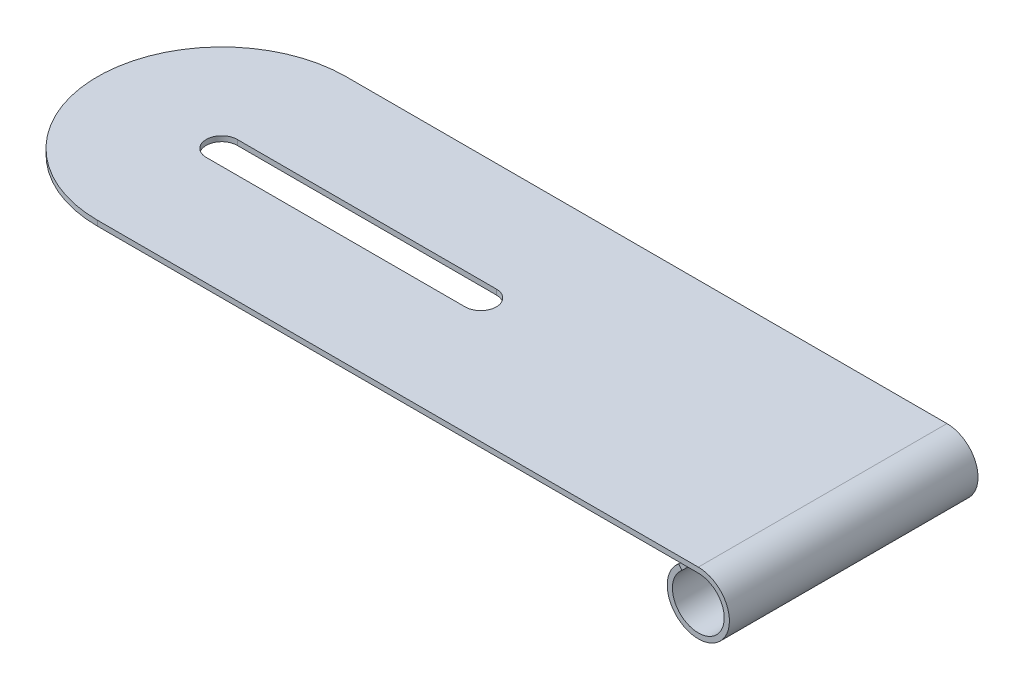
ISO-10303-21;
HEADER;
FILE_DESCRIPTION(('STEP AP214'),'2;1');
FILE_NAME('part.step','',(''),(''),'','','');
FILE_SCHEMA(('AUTOMOTIVE_DESIGN { 1 0 10303 214 1 1 1 1 }'));
ENDSEC;
DATA;
#1=APPLICATION_CONTEXT('core data for automotive mechanical design processes');
#2=APPLICATION_PROTOCOL_DEFINITION('international standard','automotive_design',2000,#1);
#3=PRODUCT_CONTEXT('',#1,'mechanical');
#4=PRODUCT('Part','Part','',(#3));
#5=PRODUCT_RELATED_PRODUCT_CATEGORY('part','',(#4));
#6=PRODUCT_DEFINITION_FORMATION('','',#4);
#7=PRODUCT_DEFINITION_CONTEXT('part definition',#1,'design');
#8=PRODUCT_DEFINITION('design','',#6,#7);
#9=PRODUCT_DEFINITION_SHAPE('','',#8);
#10=(LENGTH_UNIT() NAMED_UNIT(*) SI_UNIT(.MILLI.,.METRE.));
#11=(NAMED_UNIT(*) PLANE_ANGLE_UNIT() SI_UNIT($,.RADIAN.));
#12=(NAMED_UNIT(*) SI_UNIT($,.STERADIAN.) SOLID_ANGLE_UNIT());
#13=UNCERTAINTY_MEASURE_WITH_UNIT(LENGTH_MEASURE(1.E-05),#10,'distance_accuracy_value','');
#14=(GEOMETRIC_REPRESENTATION_CONTEXT(3) GLOBAL_UNCERTAINTY_ASSIGNED_CONTEXT((#13)) GLOBAL_UNIT_ASSIGNED_CONTEXT((#10,
#11,#12)) REPRESENTATION_CONTEXT('',''));
#15=CARTESIAN_POINT('',(0.,0.,0.));
#16=DIRECTION('',(0.,0.,1.));
#17=DIRECTION('',(1.,0.,0.));
#18=AXIS2_PLACEMENT_3D('',#15,#16,#17);
#19=CARTESIAN_POINT('',(0.,0.,24.));
#20=DIRECTION('',(0.,0.,1.));
#21=DIRECTION('',(1.,0.,0.));
#22=AXIS2_PLACEMENT_3D('',#19,#20,#21);
#23=PLANE('',#22);
#24=DIRECTION('',(-1.,0.,0.));
#25=VECTOR('',#24,1.);
#26=CARTESIAN_POINT('',(0.,3.,24.));
#27=LINE('',#26,#25);
#28=CARTESIAN_POINT('',(0.,3.,24.));
#29=VERTEX_POINT('',#28);
#30=CARTESIAN_POINT('',(-58.,2.99999999999999,24.));
#31=VERTEX_POINT('',#30);
#32=EDGE_CURVE('E151',#29,#31,#27,.T.);
#33=ORIENTED_EDGE('',*,*,#32,.T.);
#34=DIRECTION('',(0.,1.,0.));
#35=VECTOR('',#34,1.);
#36=CARTESIAN_POINT('',(-58.,1.99999999999999,24.));
#37=LINE('',#36,#35);
#38=CARTESIAN_POINT('',(-58.,2.5,24.));
#39=VERTEX_POINT('',#38);
#40=EDGE_CURVE('E141',#39,#31,#37,.T.);
#41=ORIENTED_EDGE('',*,*,#40,.F.);
#42=DIRECTION('',(1.,0.,0.));
#43=VECTOR('',#42,1.);
#44=CARTESIAN_POINT('',(0.,2.5,24.));
#45=LINE('',#44,#43);
#46=CARTESIAN_POINT('',(0.,2.5,24.));
#47=VERTEX_POINT('',#46);
#48=EDGE_CURVE('E155',#39,#47,#45,.T.);
#49=ORIENTED_EDGE('',*,*,#48,.T.);
#50=CARTESIAN_POINT('',(0.,0.,24.));
#51=DIRECTION('',(0.,0.,-1.));
#52=DIRECTION('',(1.,0.,0.));
#53=AXIS2_PLACEMENT_3D('',#50,#51,#52);
#54=CIRCLE('',#53,2.5);
#55=CARTESIAN_POINT('',(-1.57536713409333,1.94118994248851,24.));
#56=VERTEX_POINT('',#55);
#57=EDGE_CURVE('E157',#47,#56,#54,.T.);
#58=ORIENTED_EDGE('',*,*,#57,.T.);
#59=DIRECTION('',(-0.630146853637333,0.776475976995406,0.));
#60=VECTOR('',#59,1.);
#61=CARTESIAN_POINT('',(-1.890440560912,2.32942793098622,24.));
#62=LINE('',#61,#60);
#63=CARTESIAN_POINT('',(-1.890440560912,2.32942793098622,24.));
#64=VERTEX_POINT('',#63);
#65=EDGE_CURVE('E159',#56,#64,#62,.T.);
#66=ORIENTED_EDGE('',*,*,#65,.T.);
#67=CARTESIAN_POINT('',(0.,0.,24.));
#68=DIRECTION('',(0.,0.,1.));
#69=DIRECTION('',(1.,0.,0.));
#70=AXIS2_PLACEMENT_3D('',#67,#68,#69);
#71=CIRCLE('',#70,3.);
#72=EDGE_CURVE('E148',#64,#29,#71,.T.);
#73=ORIENTED_EDGE('',*,*,#72,.T.);
#74=EDGE_LOOP('',(#33,#41,#49,#58,#66,#73));
#75=FACE_BOUND('',#74,.T.);
#76=ADVANCED_FACE('F34',(#75),#23,.T.);
#77=CARTESIAN_POINT('',(0.,0.,0.));
#78=DIRECTION('',(0.,0.,1.));
#79=DIRECTION('',(1.,0.,0.));
#80=AXIS2_PLACEMENT_3D('',#77,#78,#79);
#81=PLANE('',#80);
#82=DIRECTION('',(0.,1.,0.));
#83=VECTOR('',#82,1.);
#84=CARTESIAN_POINT('',(-58.,1.99999999999999,0.));
#85=LINE('',#84,#83);
#86=CARTESIAN_POINT('',(-58.,2.99999999999999,0.));
#87=VERTEX_POINT('',#86);
#88=CARTESIAN_POINT('',(-58.,2.5,0.));
#89=VERTEX_POINT('',#88);
#90=EDGE_CURVE('E183',#87,#89,#85,.F.);
#91=ORIENTED_EDGE('',*,*,#90,.F.);
#92=DIRECTION('',(-1.,0.,0.));
#93=VECTOR('',#92,1.);
#94=CARTESIAN_POINT('',(0.,3.,0.));
#95=LINE('',#94,#93);
#96=CARTESIAN_POINT('',(0.,3.,0.));
#97=VERTEX_POINT('',#96);
#98=EDGE_CURVE('E164',#97,#87,#95,.T.);
#99=ORIENTED_EDGE('',*,*,#98,.F.);
#100=CARTESIAN_POINT('',(0.,0.,0.));
#101=DIRECTION('',(0.,0.,1.));
#102=DIRECTION('',(1.,0.,0.));
#103=AXIS2_PLACEMENT_3D('',#100,#101,#102);
#104=CIRCLE('',#103,3.);
#105=CARTESIAN_POINT('',(-1.890440560912,2.32942793098622,0.));
#106=VERTEX_POINT('',#105);
#107=EDGE_CURVE('E147',#106,#97,#104,.T.);
#108=ORIENTED_EDGE('',*,*,#107,.F.);
#109=DIRECTION('',(-0.630146853637333,0.776475976995406,0.));
#110=VECTOR('',#109,1.);
#111=CARTESIAN_POINT('',(-1.890440560912,2.32942793098622,0.));
#112=LINE('',#111,#110);
#113=CARTESIAN_POINT('',(-1.57536713409333,1.94118994248851,0.));
#114=VERTEX_POINT('',#113);
#115=EDGE_CURVE('E152',#114,#106,#112,.T.);
#116=ORIENTED_EDGE('',*,*,#115,.F.);
#117=CARTESIAN_POINT('',(0.,0.,0.));
#118=DIRECTION('',(0.,0.,-1.));
#119=DIRECTION('',(1.,0.,0.));
#120=AXIS2_PLACEMENT_3D('',#117,#118,#119);
#121=CIRCLE('',#120,2.5);
#122=CARTESIAN_POINT('',(0.,2.5,0.));
#123=VERTEX_POINT('',#122);
#124=EDGE_CURVE('E169',#123,#114,#121,.T.);
#125=ORIENTED_EDGE('',*,*,#124,.F.);
#126=DIRECTION('',(1.,0.,0.));
#127=VECTOR('',#126,1.);
#128=CARTESIAN_POINT('',(0.,2.5,0.));
#129=LINE('',#128,#127);
#130=EDGE_CURVE('E167',#89,#123,#129,.T.);
#131=ORIENTED_EDGE('',*,*,#130,.F.);
#132=EDGE_LOOP('',(#91,#99,#108,#116,#125,#131));
#133=FACE_BOUND('',#132,.T.);
#134=ADVANCED_FACE('F208',(#133),#81,.F.);
#135=CARTESIAN_POINT('',(0.,0.,24.));
#136=DIRECTION('',(0.,0.,-1.));
#137=DIRECTION('',(-1.,0.,0.));
#138=AXIS2_PLACEMENT_3D('',#135,#136,#137);
#139=CYLINDRICAL_SURFACE('',#138,3.);
#140=ORIENTED_EDGE('',*,*,#107,.T.);
#141=DIRECTION('',(0.,0.,-1.));
#142=VECTOR('',#141,1.);
#143=CARTESIAN_POINT('',(0.,3.,24.));
#144=LINE('',#143,#142);
#145=EDGE_CURVE('E180',#29,#97,#144,.T.);
#146=ORIENTED_EDGE('',*,*,#145,.F.);
#147=ORIENTED_EDGE('',*,*,#72,.F.);
#148=DIRECTION('',(0.,0.,-1.));
#149=VECTOR('',#148,1.);
#150=CARTESIAN_POINT('',(-1.890440560912,2.32942793098622,24.));
#151=LINE('',#150,#149);
#152=EDGE_CURVE('E161',#64,#106,#151,.T.);
#153=ORIENTED_EDGE('',*,*,#152,.T.);
#154=EDGE_LOOP('',(#140,#146,#147,#153));
#155=FACE_BOUND('',#154,.T.);
#156=ADVANCED_FACE('F36',(#155),#139,.T.);
#157=CARTESIAN_POINT('',(0.,3.,24.));
#158=DIRECTION('',(0.,-1.,0.));
#159=DIRECTION('',(1.,0.,0.));
#160=AXIS2_PLACEMENT_3D('',#157,#158,#159);
#161=PLANE('',#160);
#162=DIRECTION('',(1.,0.,0.));
#163=VECTOR('',#162,1.);
#164=CARTESIAN_POINT('',(-33.,3.,13.5));
#165=LINE('',#164,#163);
#166=CARTESIAN_POINT('',(-58.,2.99999999999999,13.5));
#167=VERTEX_POINT('',#166);
#168=CARTESIAN_POINT('',(-33.,3.,13.5));
#169=VERTEX_POINT('',#168);
#170=EDGE_CURVE('E123',#167,#169,#165,.T.);
#171=ORIENTED_EDGE('',*,*,#170,.F.);
#172=CARTESIAN_POINT('',(-58.,2.99999999999999,12.));
#173=DIRECTION('',(0.,1.,0.));
#174=DIRECTION('',(-1.,0.,0.));
#175=AXIS2_PLACEMENT_3D('',#172,#173,#174);
#176=CIRCLE('',#175,1.5);
#177=CARTESIAN_POINT('',(-58.,2.99999999999999,10.5));
#178=VERTEX_POINT('',#177);
#179=EDGE_CURVE('E49',#178,#167,#176,.T.);
#180=ORIENTED_EDGE('',*,*,#179,.F.);
#181=DIRECTION('',(-1.,0.,0.));
#182=VECTOR('',#181,1.);
#183=CARTESIAN_POINT('',(-58.,2.99999999999999,10.5));
#184=LINE('',#183,#182);
#185=CARTESIAN_POINT('',(-33.,3.,10.5));
#186=VERTEX_POINT('',#185);
#187=EDGE_CURVE('E130',#186,#178,#184,.T.);
#188=ORIENTED_EDGE('',*,*,#187,.F.);
#189=CARTESIAN_POINT('',(-33.,3.,12.));
#190=DIRECTION('',(0.,1.,0.));
#191=DIRECTION('',(-1.,0.,0.));
#192=AXIS2_PLACEMENT_3D('',#189,#190,#191);
#193=CIRCLE('',#192,1.5);
#194=EDGE_CURVE('E114',#169,#186,#193,.T.);
#195=ORIENTED_EDGE('',*,*,#194,.F.);
#196=EDGE_LOOP('',(#171,#180,#188,#195));
#197=FACE_BOUND('',#196,.T.);
#198=ORIENTED_EDGE('',*,*,#98,.T.);
#199=CARTESIAN_POINT('',(-58.,2.99999999999999,12.));
#200=DIRECTION('',(0.,-1.,0.));
#201=DIRECTION('',(-1.,0.,0.));
#202=AXIS2_PLACEMENT_3D('',#199,#200,#201);
#203=CIRCLE('',#202,12.);
#204=EDGE_CURVE('E137',#31,#87,#203,.T.);
#205=ORIENTED_EDGE('',*,*,#204,.F.);
#206=ORIENTED_EDGE('',*,*,#32,.F.);
#207=ORIENTED_EDGE('',*,*,#145,.T.);
#208=EDGE_LOOP('',(#198,#205,#206,#207));
#209=FACE_BOUND('',#208,.T.);
#210=ADVANCED_FACE('F127',(#197,#209),#161,.F.);
#211=CARTESIAN_POINT('',(0.,2.5,24.));
#212=DIRECTION('',(0.,1.,0.));
#213=DIRECTION('',(-1.,0.,0.));
#214=AXIS2_PLACEMENT_3D('',#211,#212,#213);
#215=PLANE('',#214);
#216=DIRECTION('',(-1.,0.,0.));
#217=VECTOR('',#216,1.);
#218=CARTESIAN_POINT('',(0.,2.5,10.5));
#219=LINE('',#218,#217);
#220=CARTESIAN_POINT('',(-33.,2.5,10.5));
#221=VERTEX_POINT('',#220);
#222=CARTESIAN_POINT('',(-58.,2.49999999999999,10.5));
#223=VERTEX_POINT('',#222);
#224=EDGE_CURVE('E42',#221,#223,#219,.T.);
#225=ORIENTED_EDGE('',*,*,#224,.T.);
#226=CARTESIAN_POINT('',(-58.,2.49999999999999,12.));
#227=DIRECTION('',(0.,1.,0.));
#228=DIRECTION('',(-1.,0.,0.));
#229=AXIS2_PLACEMENT_3D('',#226,#227,#228);
#230=CIRCLE('',#229,1.5);
#231=CARTESIAN_POINT('',(-58.,2.49999999999999,13.5));
#232=VERTEX_POINT('',#231);
#233=EDGE_CURVE('E11',#223,#232,#230,.T.);
#234=ORIENTED_EDGE('',*,*,#233,.T.);
#235=DIRECTION('',(1.,0.,0.));
#236=VECTOR('',#235,1.);
#237=CARTESIAN_POINT('',(0.,2.5,13.5));
#238=LINE('',#237,#236);
#239=CARTESIAN_POINT('',(-33.,2.5,13.5));
#240=VERTEX_POINT('',#239);
#241=EDGE_CURVE('E185',#232,#240,#238,.T.);
#242=ORIENTED_EDGE('',*,*,#241,.T.);
#243=CARTESIAN_POINT('',(-33.,2.5,12.));
#244=DIRECTION('',(0.,1.,0.));
#245=DIRECTION('',(-1.,0.,0.));
#246=AXIS2_PLACEMENT_3D('',#243,#244,#245);
#247=CIRCLE('',#246,1.5);
#248=EDGE_CURVE('E117',#240,#221,#247,.T.);
#249=ORIENTED_EDGE('',*,*,#248,.T.);
#250=EDGE_LOOP('',(#225,#234,#242,#249));
#251=FACE_BOUND('',#250,.T.);
#252=ORIENTED_EDGE('',*,*,#48,.F.);
#253=CARTESIAN_POINT('',(-58.,2.49999999999999,12.));
#254=DIRECTION('',(0.,1.,0.));
#255=DIRECTION('',(-1.,0.,0.));
#256=AXIS2_PLACEMENT_3D('',#253,#254,#255);
#257=CIRCLE('',#256,12.);
#258=EDGE_CURVE('E144',#39,#89,#257,.F.);
#259=ORIENTED_EDGE('',*,*,#258,.T.);
#260=ORIENTED_EDGE('',*,*,#130,.T.);
#261=DIRECTION('',(0.,0.,-1.));
#262=VECTOR('',#261,1.);
#263=CARTESIAN_POINT('',(0.,2.5,24.));
#264=LINE('',#263,#262);
#265=EDGE_CURVE('E177',#47,#123,#264,.T.);
#266=ORIENTED_EDGE('',*,*,#265,.F.);
#267=EDGE_LOOP('',(#252,#259,#260,#266));
#268=FACE_BOUND('',#267,.T.);
#269=ADVANCED_FACE('F189',(#251,#268),#215,.F.);
#270=CARTESIAN_POINT('',(0.,0.,24.));
#271=DIRECTION('',(0.,0.,-1.));
#272=DIRECTION('',(-1.,0.,0.));
#273=AXIS2_PLACEMENT_3D('',#270,#271,#272);
#274=CYLINDRICAL_SURFACE('',#273,2.5);
#275=ORIENTED_EDGE('',*,*,#124,.T.);
#276=DIRECTION('',(0.,0.,-1.));
#277=VECTOR('',#276,1.);
#278=CARTESIAN_POINT('',(-1.57536713409333,1.94118994248851,24.));
#279=LINE('',#278,#277);
#280=EDGE_CURVE('E174',#56,#114,#279,.T.);
#281=ORIENTED_EDGE('',*,*,#280,.F.);
#282=ORIENTED_EDGE('',*,*,#57,.F.);
#283=ORIENTED_EDGE('',*,*,#265,.T.);
#284=EDGE_LOOP('',(#275,#281,#282,#283));
#285=FACE_BOUND('',#284,.T.);
#286=ADVANCED_FACE('F219',(#285),#274,.F.);
#287=CARTESIAN_POINT('',(-1.890440560912,2.32942793098622,24.));
#288=DIRECTION('',(-0.776475976995405,-0.630146853637333,0.));
#289=DIRECTION('',(0.630146853637333,-0.776475976995406,0.));
#290=AXIS2_PLACEMENT_3D('',#287,#288,#289);
#291=PLANE('',#290);
#292=ORIENTED_EDGE('',*,*,#115,.T.);
#293=ORIENTED_EDGE('',*,*,#152,.F.);
#294=ORIENTED_EDGE('',*,*,#65,.F.);
#295=ORIENTED_EDGE('',*,*,#280,.T.);
#296=EDGE_LOOP('',(#292,#293,#294,#295));
#297=FACE_BOUND('',#296,.T.);
#298=ADVANCED_FACE('F203',(#297),#291,.F.);
#299=CARTESIAN_POINT('',(-58.,1.99999999999999,12.));
#300=DIRECTION('',(0.,1.,0.));
#301=DIRECTION('',(-1.,0.,0.));
#302=AXIS2_PLACEMENT_3D('',#299,#300,#301);
#303=CYLINDRICAL_SURFACE('',#302,12.);
#304=ORIENTED_EDGE('',*,*,#204,.T.);
#305=ORIENTED_EDGE('',*,*,#90,.T.);
#306=ORIENTED_EDGE('',*,*,#258,.F.);
#307=ORIENTED_EDGE('',*,*,#40,.T.);
#308=EDGE_LOOP('',(#304,#305,#306,#307));
#309=FACE_BOUND('',#308,.T.);
#310=ADVANCED_FACE('F196',(#309),#303,.T.);
#311=CARTESIAN_POINT('',(-58.,1.99999999999999,12.));
#312=DIRECTION('',(0.,1.,0.));
#313=DIRECTION('',(-1.,0.,0.));
#314=AXIS2_PLACEMENT_3D('',#311,#312,#313);
#315=CYLINDRICAL_SURFACE('',#314,1.5);
#316=DIRECTION('',(0.,1.,0.));
#317=VECTOR('',#316,1.);
#318=CARTESIAN_POINT('',(-58.,1.99999999999999,10.5));
#319=LINE('',#318,#317);
#320=EDGE_CURVE('E135',#223,#178,#319,.T.);
#321=ORIENTED_EDGE('',*,*,#320,.T.);
#322=ORIENTED_EDGE('',*,*,#179,.T.);
#323=DIRECTION('',(0.,1.,0.));
#324=VECTOR('',#323,1.);
#325=CARTESIAN_POINT('',(-58.,1.99999999999999,13.5));
#326=LINE('',#325,#324);
#327=EDGE_CURVE('E120',#232,#167,#326,.T.);
#328=ORIENTED_EDGE('',*,*,#327,.F.);
#329=ORIENTED_EDGE('',*,*,#233,.F.);
#330=EDGE_LOOP('',(#321,#322,#328,#329));
#331=FACE_BOUND('',#330,.T.);
#332=ADVANCED_FACE('F194',(#331),#315,.F.);
#333=CARTESIAN_POINT('',(-58.,1.99999999999999,10.5));
#334=DIRECTION('',(0.,0.,-1.));
#335=DIRECTION('',(-1.,0.,0.));
#336=AXIS2_PLACEMENT_3D('',#333,#334,#335);
#337=PLANE('',#336);
#338=DIRECTION('',(0.,1.,0.));
#339=VECTOR('',#338,1.);
#340=CARTESIAN_POINT('',(-33.,2.,10.5));
#341=LINE('',#340,#339);
#342=EDGE_CURVE('E119',#221,#186,#341,.T.);
#343=ORIENTED_EDGE('',*,*,#342,.T.);
#344=ORIENTED_EDGE('',*,*,#187,.T.);
#345=ORIENTED_EDGE('',*,*,#320,.F.);
#346=ORIENTED_EDGE('',*,*,#224,.F.);
#347=EDGE_LOOP('',(#343,#344,#345,#346));
#348=FACE_BOUND('',#347,.T.);
#349=ADVANCED_FACE('F193',(#348),#337,.F.);
#350=CARTESIAN_POINT('',(-33.,2.,12.));
#351=DIRECTION('',(0.,1.,0.));
#352=DIRECTION('',(-1.,0.,0.));
#353=AXIS2_PLACEMENT_3D('',#350,#351,#352);
#354=CYLINDRICAL_SURFACE('',#353,1.5);
#355=DIRECTION('',(0.,1.,0.));
#356=VECTOR('',#355,1.);
#357=CARTESIAN_POINT('',(-33.,2.,13.5));
#358=LINE('',#357,#356);
#359=EDGE_CURVE('E57',#240,#169,#358,.T.);
#360=ORIENTED_EDGE('',*,*,#359,.T.);
#361=ORIENTED_EDGE('',*,*,#194,.T.);
#362=ORIENTED_EDGE('',*,*,#342,.F.);
#363=ORIENTED_EDGE('',*,*,#248,.F.);
#364=EDGE_LOOP('',(#360,#361,#362,#363));
#365=FACE_BOUND('',#364,.T.);
#366=ADVANCED_FACE('F111',(#365),#354,.F.);
#367=CARTESIAN_POINT('',(-33.,2.,13.5));
#368=DIRECTION('',(0.,0.,1.));
#369=DIRECTION('',(1.,0.,0.));
#370=AXIS2_PLACEMENT_3D('',#367,#368,#369);
#371=PLANE('',#370);
#372=ORIENTED_EDGE('',*,*,#327,.T.);
#373=ORIENTED_EDGE('',*,*,#170,.T.);
#374=ORIENTED_EDGE('',*,*,#359,.F.);
#375=ORIENTED_EDGE('',*,*,#241,.F.);
#376=EDGE_LOOP('',(#372,#373,#374,#375));
#377=FACE_BOUND('',#376,.T.);
#378=ADVANCED_FACE('F124',(#377),#371,.F.);
#379=CLOSED_SHELL('',(#76,#134,#156,#210,#269,#286,#298,#310,#332,#349,#366,#378));
#380=MANIFOLD_SOLID_BREP('B2',#379);
#381=ADVANCED_BREP_SHAPE_REPRESENTATION('',(#18,#380),#14);
#382=SHAPE_DEFINITION_REPRESENTATION(#9,#381);
ENDSEC;
END-ISO-10303-21;
